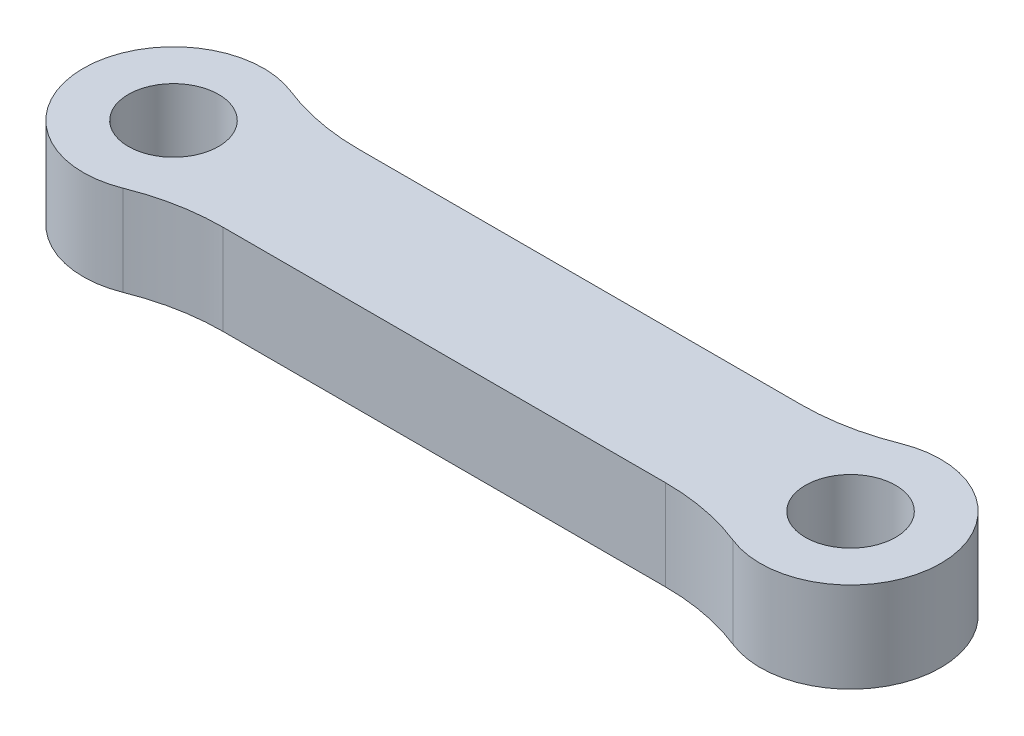
ISO-10303-21;
HEADER;
FILE_DESCRIPTION(('STEP AP214'),'2;1');
FILE_NAME('part.step','',(''),(''),'','','');
FILE_SCHEMA(('AUTOMOTIVE_DESIGN { 1 0 10303 214 1 1 1 1 }'));
ENDSEC;
DATA;
#1=APPLICATION_CONTEXT('core data for automotive mechanical design processes');
#2=APPLICATION_PROTOCOL_DEFINITION('international standard','automotive_design',2000,#1);
#3=PRODUCT_CONTEXT('',#1,'mechanical');
#4=PRODUCT('Part','Part','',(#3));
#5=PRODUCT_RELATED_PRODUCT_CATEGORY('part','',(#4));
#6=PRODUCT_DEFINITION_FORMATION('','',#4);
#7=PRODUCT_DEFINITION_CONTEXT('part definition',#1,'design');
#8=PRODUCT_DEFINITION('design','',#6,#7);
#9=PRODUCT_DEFINITION_SHAPE('','',#8);
#10=(LENGTH_UNIT() NAMED_UNIT(*) SI_UNIT(.MILLI.,.METRE.));
#11=(NAMED_UNIT(*) PLANE_ANGLE_UNIT() SI_UNIT($,.RADIAN.));
#12=(NAMED_UNIT(*) SI_UNIT($,.STERADIAN.) SOLID_ANGLE_UNIT());
#13=UNCERTAINTY_MEASURE_WITH_UNIT(LENGTH_MEASURE(1.E-05),#10,'distance_accuracy_value','');
#14=(GEOMETRIC_REPRESENTATION_CONTEXT(3) GLOBAL_UNCERTAINTY_ASSIGNED_CONTEXT((#13)) GLOBAL_UNIT_ASSIGNED_CONTEXT((#10,
#11,#12)) REPRESENTATION_CONTEXT('',''));
#15=CARTESIAN_POINT('',(0.,0.,0.));
#16=DIRECTION('',(0.,0.,1.));
#17=DIRECTION('',(1.,0.,0.));
#18=AXIS2_PLACEMENT_3D('',#15,#16,#17);
#19=CARTESIAN_POINT('',(0.,4.,0.));
#20=DIRECTION('',(0.,1.,0.));
#21=DIRECTION('',(0.,0.,1.));
#22=AXIS2_PLACEMENT_3D('',#19,#20,#21);
#23=PLANE('',#22);
#24=CARTESIAN_POINT('',(0.,4.,0.));
#25=DIRECTION('',(0.,1.,0.));
#26=DIRECTION('',(0.,0.,1.));
#27=AXIS2_PLACEMENT_3D('',#24,#25,#26);
#28=CIRCLE('',#27,2.);
#29=CARTESIAN_POINT('',(0.,4.,2.));
#30=VERTEX_POINT('',#29);
#31=EDGE_CURVE('E163',#30,#30,#28,.T.);
#32=ORIENTED_EDGE('',*,*,#31,.F.);
#33=EDGE_LOOP('',(#32));
#34=FACE_BOUND('',#33,.T.);
#35=DIRECTION('',(-1.,0.,0.));
#36=VECTOR('',#35,1.);
#37=CARTESIAN_POINT('',(2.64575131106459,4.,-3.));
#38=LINE('',#37,#36);
#39=CARTESIAN_POINT('',(24.8038475772934,4.,-3.));
#40=VERTEX_POINT('',#39);
#41=CARTESIAN_POINT('',(5.19615242270663,4.,-3.));
#42=VERTEX_POINT('',#41);
#43=EDGE_CURVE('E116',#40,#42,#38,.T.);
#44=ORIENTED_EDGE('',*,*,#43,.T.);
#45=CARTESIAN_POINT('',(5.19615242270663,4.,-13.));
#46=DIRECTION('',(0.,1.,0.));
#47=DIRECTION('',(0.,0.,1.));
#48=AXIS2_PLACEMENT_3D('',#45,#46,#47);
#49=CIRCLE('',#48,10.);
#50=CARTESIAN_POINT('',(1.48461497791618,4.,-3.71428571428571));
#51=VERTEX_POINT('',#50);
#52=EDGE_CURVE('E148',#42,#51,#49,.F.);
#53=ORIENTED_EDGE('',*,*,#52,.T.);
#54=CARTESIAN_POINT('',(0.,4.,0.));
#55=DIRECTION('',(0.,1.,0.));
#56=DIRECTION('',(0.,0.,1.));
#57=AXIS2_PLACEMENT_3D('',#54,#55,#56);
#58=CIRCLE('',#57,4.);
#59=CARTESIAN_POINT('',(1.48461497791618,4.,3.71428571428571));
#60=VERTEX_POINT('',#59);
#61=EDGE_CURVE('E124',#51,#60,#58,.T.);
#62=ORIENTED_EDGE('',*,*,#61,.T.);
#63=CARTESIAN_POINT('',(5.19615242270663,4.,13.));
#64=DIRECTION('',(0.,1.,0.));
#65=DIRECTION('',(0.,0.,1.));
#66=AXIS2_PLACEMENT_3D('',#63,#64,#65);
#67=CIRCLE('',#66,10.);
#68=CARTESIAN_POINT('',(5.19615242270663,4.,3.));
#69=VERTEX_POINT('',#68);
#70=EDGE_CURVE('E11',#60,#69,#67,.F.);
#71=ORIENTED_EDGE('',*,*,#70,.T.);
#72=DIRECTION('',(1.,0.,0.));
#73=VECTOR('',#72,1.);
#74=CARTESIAN_POINT('',(2.64575131106459,4.,3.));
#75=LINE('',#74,#73);
#76=CARTESIAN_POINT('',(24.8038475772934,4.,3.));
#77=VERTEX_POINT('',#76);
#78=EDGE_CURVE('E127',#69,#77,#75,.T.);
#79=ORIENTED_EDGE('',*,*,#78,.T.);
#80=CARTESIAN_POINT('',(24.8038475772934,4.,13.));
#81=DIRECTION('',(0.,1.,0.));
#82=DIRECTION('',(0.,0.,1.));
#83=AXIS2_PLACEMENT_3D('',#80,#81,#82);
#84=CIRCLE('',#83,10.);
#85=CARTESIAN_POINT('',(28.5153850220838,4.,3.71428571428572));
#86=VERTEX_POINT('',#85);
#87=EDGE_CURVE('E152',#77,#86,#84,.F.);
#88=ORIENTED_EDGE('',*,*,#87,.T.);
#89=CARTESIAN_POINT('',(30.,4.,0.));
#90=DIRECTION('',(0.,1.,0.));
#91=DIRECTION('',(0.,0.,-1.));
#92=AXIS2_PLACEMENT_3D('',#89,#90,#91);
#93=CIRCLE('',#92,4.);
#94=CARTESIAN_POINT('',(28.5153850220838,4.,-3.71428571428572));
#95=VERTEX_POINT('',#94);
#96=EDGE_CURVE('E167',#86,#95,#93,.T.);
#97=ORIENTED_EDGE('',*,*,#96,.T.);
#98=CARTESIAN_POINT('',(24.8038475772934,4.,-13.));
#99=DIRECTION('',(0.,1.,0.));
#100=DIRECTION('',(0.,0.,1.));
#101=AXIS2_PLACEMENT_3D('',#98,#99,#100);
#102=CIRCLE('',#101,10.);
#103=EDGE_CURVE('E107',#95,#40,#102,.F.);
#104=ORIENTED_EDGE('',*,*,#103,.T.);
#105=EDGE_LOOP('',(#44,#53,#62,#71,#79,#88,#97,#104));
#106=FACE_BOUND('',#105,.T.);
#107=CARTESIAN_POINT('',(30.,4.,0.));
#108=DIRECTION('',(0.,1.,0.));
#109=DIRECTION('',(0.,0.,1.));
#110=AXIS2_PLACEMENT_3D('',#107,#108,#109);
#111=CIRCLE('',#110,2.);
#112=CARTESIAN_POINT('',(30.,4.,2.));
#113=VERTEX_POINT('',#112);
#114=EDGE_CURVE('E284',#113,#113,#111,.T.);
#115=ORIENTED_EDGE('',*,*,#114,.F.);
#116=EDGE_LOOP('',(#115));
#117=FACE_BOUND('',#116,.T.);
#118=ADVANCED_FACE('F32',(#34,#106,#117),#23,.T.);
#119=CARTESIAN_POINT('',(0.,0.,0.));
#120=DIRECTION('',(0.,1.,0.));
#121=DIRECTION('',(0.,0.,1.));
#122=AXIS2_PLACEMENT_3D('',#119,#120,#121);
#123=PLANE('',#122);
#124=CARTESIAN_POINT('',(0.,0.,0.));
#125=DIRECTION('',(0.,1.,0.));
#126=DIRECTION('',(0.,0.,1.));
#127=AXIS2_PLACEMENT_3D('',#124,#125,#126);
#128=CIRCLE('',#127,4.);
#129=CARTESIAN_POINT('',(1.48461497791618,0.,-3.71428571428571));
#130=VERTEX_POINT('',#129);
#131=CARTESIAN_POINT('',(1.48461497791618,0.,3.71428571428571));
#132=VERTEX_POINT('',#131);
#133=EDGE_CURVE('E155',#130,#132,#128,.T.);
#134=ORIENTED_EDGE('',*,*,#133,.F.);
#135=CARTESIAN_POINT('',(5.19615242270663,0.,-13.));
#136=DIRECTION('',(0.,1.,0.));
#137=DIRECTION('',(0.,0.,1.));
#138=AXIS2_PLACEMENT_3D('',#135,#136,#137);
#139=CIRCLE('',#138,10.);
#140=CARTESIAN_POINT('',(5.19615242270663,0.,-3.));
#141=VERTEX_POINT('',#140);
#142=EDGE_CURVE('E123',#130,#141,#139,.T.);
#143=ORIENTED_EDGE('',*,*,#142,.T.);
#144=DIRECTION('',(-1.,0.,0.));
#145=VECTOR('',#144,1.);
#146=CARTESIAN_POINT('',(2.64575131106459,0.,-3.));
#147=LINE('',#146,#145);
#148=CARTESIAN_POINT('',(24.8038475772934,0.,-3.));
#149=VERTEX_POINT('',#148);
#150=EDGE_CURVE('E113',#149,#141,#147,.T.);
#151=ORIENTED_EDGE('',*,*,#150,.F.);
#152=CARTESIAN_POINT('',(24.8038475772934,0.,-13.));
#153=DIRECTION('',(0.,1.,0.));
#154=DIRECTION('',(0.,0.,1.));
#155=AXIS2_PLACEMENT_3D('',#152,#153,#154);
#156=CIRCLE('',#155,10.);
#157=CARTESIAN_POINT('',(28.5153850220838,0.,-3.71428571428572));
#158=VERTEX_POINT('',#157);
#159=EDGE_CURVE('E97',#149,#158,#156,.T.);
#160=ORIENTED_EDGE('',*,*,#159,.T.);
#161=CARTESIAN_POINT('',(30.,0.,0.));
#162=DIRECTION('',(0.,1.,0.));
#163=DIRECTION('',(0.,0.,-1.));
#164=AXIS2_PLACEMENT_3D('',#161,#162,#163);
#165=CIRCLE('',#164,4.);
#166=CARTESIAN_POINT('',(28.5153850220838,0.,3.71428571428572));
#167=VERTEX_POINT('',#166);
#168=EDGE_CURVE('E125',#167,#158,#165,.T.);
#169=ORIENTED_EDGE('',*,*,#168,.F.);
#170=CARTESIAN_POINT('',(24.8038475772934,0.,13.));
#171=DIRECTION('',(0.,1.,0.));
#172=DIRECTION('',(0.,0.,1.));
#173=AXIS2_PLACEMENT_3D('',#170,#171,#172);
#174=CIRCLE('',#173,10.);
#175=CARTESIAN_POINT('',(24.8038475772934,0.,3.));
#176=VERTEX_POINT('',#175);
#177=EDGE_CURVE('E150',#167,#176,#174,.T.);
#178=ORIENTED_EDGE('',*,*,#177,.T.);
#179=DIRECTION('',(1.,0.,0.));
#180=VECTOR('',#179,1.);
#181=CARTESIAN_POINT('',(2.64575131106459,0.,3.));
#182=LINE('',#181,#180);
#183=CARTESIAN_POINT('',(5.19615242270663,0.,3.));
#184=VERTEX_POINT('',#183);
#185=EDGE_CURVE('E129',#184,#176,#182,.T.);
#186=ORIENTED_EDGE('',*,*,#185,.F.);
#187=CARTESIAN_POINT('',(5.19615242270663,0.,13.));
#188=DIRECTION('',(0.,1.,0.));
#189=DIRECTION('',(0.,0.,1.));
#190=AXIS2_PLACEMENT_3D('',#187,#188,#189);
#191=CIRCLE('',#190,10.);
#192=EDGE_CURVE('E40',#184,#132,#191,.T.);
#193=ORIENTED_EDGE('',*,*,#192,.T.);
#194=EDGE_LOOP('',(#134,#143,#151,#160,#169,#178,#186,#193));
#195=FACE_BOUND('',#194,.T.);
#196=CARTESIAN_POINT('',(0.,0.,0.));
#197=DIRECTION('',(0.,1.,0.));
#198=DIRECTION('',(0.,0.,1.));
#199=AXIS2_PLACEMENT_3D('',#196,#197,#198);
#200=CIRCLE('',#199,2.);
#201=CARTESIAN_POINT('',(0.,0.,2.));
#202=VERTEX_POINT('',#201);
#203=EDGE_CURVE('E290',#202,#202,#200,.T.);
#204=ORIENTED_EDGE('',*,*,#203,.T.);
#205=EDGE_LOOP('',(#204));
#206=FACE_BOUND('',#205,.T.);
#207=CARTESIAN_POINT('',(30.,0.,0.));
#208=DIRECTION('',(0.,1.,0.));
#209=DIRECTION('',(0.,0.,1.));
#210=AXIS2_PLACEMENT_3D('',#207,#208,#209);
#211=CIRCLE('',#210,2.);
#212=CARTESIAN_POINT('',(30.,0.,2.));
#213=VERTEX_POINT('',#212);
#214=EDGE_CURVE('E287',#213,#213,#211,.T.);
#215=ORIENTED_EDGE('',*,*,#214,.T.);
#216=EDGE_LOOP('',(#215));
#217=FACE_BOUND('',#216,.T.);
#218=ADVANCED_FACE('F121',(#195,#206,#217),#123,.F.);
#219=CARTESIAN_POINT('',(0.,4.,0.));
#220=DIRECTION('',(0.,-1.,0.));
#221=DIRECTION('',(0.,0.,-1.));
#222=AXIS2_PLACEMENT_3D('',#219,#220,#221);
#223=CYLINDRICAL_SURFACE('',#222,4.);
#224=ORIENTED_EDGE('',*,*,#61,.F.);
#225=DIRECTION('',(0.,-1.,0.));
#226=VECTOR('',#225,1.);
#227=CARTESIAN_POINT('',(1.48461497791618,4.,-3.71428571428571));
#228=LINE('',#227,#226);
#229=EDGE_CURVE('E139',#51,#130,#228,.T.);
#230=ORIENTED_EDGE('',*,*,#229,.T.);
#231=ORIENTED_EDGE('',*,*,#133,.T.);
#232=DIRECTION('',(0.,-1.,0.));
#233=VECTOR('',#232,1.);
#234=CARTESIAN_POINT('',(1.48461497791618,4.,3.71428571428571));
#235=LINE('',#234,#233);
#236=EDGE_CURVE('E137',#132,#60,#235,.F.);
#237=ORIENTED_EDGE('',*,*,#236,.T.);
#238=EDGE_LOOP('',(#224,#230,#231,#237));
#239=FACE_BOUND('',#238,.T.);
#240=ADVANCED_FACE('F161',(#239),#223,.T.);
#241=CARTESIAN_POINT('',(2.64575131106459,4.,3.));
#242=DIRECTION('',(0.,0.,-1.));
#243=DIRECTION('',(-1.,0.,0.));
#244=AXIS2_PLACEMENT_3D('',#241,#242,#243);
#245=PLANE('',#244);
#246=ORIENTED_EDGE('',*,*,#185,.T.);
#247=DIRECTION('',(0.,1.,0.));
#248=VECTOR('',#247,1.);
#249=CARTESIAN_POINT('',(24.8038475772934,4.,3.));
#250=LINE('',#249,#248);
#251=EDGE_CURVE('E47',#176,#77,#250,.T.);
#252=ORIENTED_EDGE('',*,*,#251,.T.);
#253=ORIENTED_EDGE('',*,*,#78,.F.);
#254=DIRECTION('',(0.,1.,0.));
#255=VECTOR('',#254,1.);
#256=CARTESIAN_POINT('',(5.19615242270663,0.,3.));
#257=LINE('',#256,#255);
#258=EDGE_CURVE('E142',#69,#184,#257,.F.);
#259=ORIENTED_EDGE('',*,*,#258,.T.);
#260=EDGE_LOOP('',(#246,#252,#253,#259));
#261=FACE_BOUND('',#260,.T.);
#262=ADVANCED_FACE('F165',(#261),#245,.F.);
#263=CARTESIAN_POINT('',(30.,4.,0.));
#264=DIRECTION('',(0.,-1.,0.));
#265=DIRECTION('',(0.,0.,-1.));
#266=AXIS2_PLACEMENT_3D('',#263,#264,#265);
#267=CYLINDRICAL_SURFACE('',#266,4.);
#268=ORIENTED_EDGE('',*,*,#168,.T.);
#269=DIRECTION('',(0.,-1.,0.));
#270=VECTOR('',#269,1.);
#271=CARTESIAN_POINT('',(28.5153850220838,4.,-3.71428571428572));
#272=LINE('',#271,#270);
#273=EDGE_CURVE('E102',#158,#95,#272,.F.);
#274=ORIENTED_EDGE('',*,*,#273,.T.);
#275=ORIENTED_EDGE('',*,*,#96,.F.);
#276=DIRECTION('',(0.,-1.,0.));
#277=VECTOR('',#276,1.);
#278=CARTESIAN_POINT('',(28.5153850220838,4.,3.71428571428572));
#279=LINE('',#278,#277);
#280=EDGE_CURVE('E117',#86,#167,#279,.T.);
#281=ORIENTED_EDGE('',*,*,#280,.T.);
#282=EDGE_LOOP('',(#268,#274,#275,#281));
#283=FACE_BOUND('',#282,.T.);
#284=ADVANCED_FACE('F201',(#283),#267,.T.);
#285=CARTESIAN_POINT('',(2.64575131106459,4.,-3.));
#286=DIRECTION('',(0.,0.,1.));
#287=DIRECTION('',(1.,0.,0.));
#288=AXIS2_PLACEMENT_3D('',#285,#286,#287);
#289=PLANE('',#288);
#290=ORIENTED_EDGE('',*,*,#43,.F.);
#291=DIRECTION('',(0.,1.,0.));
#292=VECTOR('',#291,1.);
#293=CARTESIAN_POINT('',(24.8038475772934,0.,-3.));
#294=LINE('',#293,#292);
#295=EDGE_CURVE('E101',#40,#149,#294,.F.);
#296=ORIENTED_EDGE('',*,*,#295,.T.);
#297=ORIENTED_EDGE('',*,*,#150,.T.);
#298=DIRECTION('',(0.,1.,0.));
#299=VECTOR('',#298,1.);
#300=CARTESIAN_POINT('',(5.19615242270663,4.,-3.));
#301=LINE('',#300,#299);
#302=EDGE_CURVE('E118',#141,#42,#301,.T.);
#303=ORIENTED_EDGE('',*,*,#302,.T.);
#304=EDGE_LOOP('',(#290,#296,#297,#303));
#305=FACE_BOUND('',#304,.T.);
#306=ADVANCED_FACE('F112',(#305),#289,.F.);
#307=CARTESIAN_POINT('',(0.,4.,0.));
#308=DIRECTION('',(0.,-1.,0.));
#309=DIRECTION('',(0.,0.,-1.));
#310=AXIS2_PLACEMENT_3D('',#307,#308,#309);
#311=CYLINDRICAL_SURFACE('',#310,2.);
#312=ORIENTED_EDGE('',*,*,#31,.T.);
#313=EDGE_LOOP('',(#312));
#314=FACE_BOUND('',#313,.T.);
#315=ORIENTED_EDGE('',*,*,#203,.F.);
#316=EDGE_LOOP('',(#315));
#317=FACE_BOUND('',#316,.T.);
#318=ADVANCED_FACE('F196',(#314,#317),#311,.F.);
#319=CARTESIAN_POINT('',(30.,4.,0.));
#320=DIRECTION('',(0.,-1.,0.));
#321=DIRECTION('',(0.,0.,-1.));
#322=AXIS2_PLACEMENT_3D('',#319,#320,#321);
#323=CYLINDRICAL_SURFACE('',#322,2.);
#324=ORIENTED_EDGE('',*,*,#114,.T.);
#325=EDGE_LOOP('',(#324));
#326=FACE_BOUND('',#325,.T.);
#327=ORIENTED_EDGE('',*,*,#214,.F.);
#328=EDGE_LOOP('',(#327));
#329=FACE_BOUND('',#328,.T.);
#330=ADVANCED_FACE('F185',(#326,#329),#323,.F.);
#331=CARTESIAN_POINT('',(24.8038475772934,4.,-13.));
#332=DIRECTION('',(0.,-1.,0.));
#333=DIRECTION('',(0.,0.,-1.));
#334=AXIS2_PLACEMENT_3D('',#331,#332,#333);
#335=CYLINDRICAL_SURFACE('',#334,10.);
#336=ORIENTED_EDGE('',*,*,#103,.F.);
#337=ORIENTED_EDGE('',*,*,#273,.F.);
#338=ORIENTED_EDGE('',*,*,#159,.F.);
#339=ORIENTED_EDGE('',*,*,#295,.F.);
#340=EDGE_LOOP('',(#336,#337,#338,#339));
#341=FACE_BOUND('',#340,.T.);
#342=ADVANCED_FACE('F100',(#341),#335,.F.);
#343=CARTESIAN_POINT('',(5.19615242270663,4.,-13.));
#344=DIRECTION('',(0.,-1.,0.));
#345=DIRECTION('',(0.,0.,-1.));
#346=AXIS2_PLACEMENT_3D('',#343,#344,#345);
#347=CYLINDRICAL_SURFACE('',#346,10.);
#348=ORIENTED_EDGE('',*,*,#52,.F.);
#349=ORIENTED_EDGE('',*,*,#302,.F.);
#350=ORIENTED_EDGE('',*,*,#142,.F.);
#351=ORIENTED_EDGE('',*,*,#229,.F.);
#352=EDGE_LOOP('',(#348,#349,#350,#351));
#353=FACE_BOUND('',#352,.T.);
#354=ADVANCED_FACE('F176',(#353),#347,.F.);
#355=CARTESIAN_POINT('',(24.8038475772934,4.,13.));
#356=DIRECTION('',(0.,-1.,0.));
#357=DIRECTION('',(0.,0.,-1.));
#358=AXIS2_PLACEMENT_3D('',#355,#356,#357);
#359=CYLINDRICAL_SURFACE('',#358,10.);
#360=ORIENTED_EDGE('',*,*,#87,.F.);
#361=ORIENTED_EDGE('',*,*,#251,.F.);
#362=ORIENTED_EDGE('',*,*,#177,.F.);
#363=ORIENTED_EDGE('',*,*,#280,.F.);
#364=EDGE_LOOP('',(#360,#361,#362,#363));
#365=FACE_BOUND('',#364,.T.);
#366=ADVANCED_FACE('F178',(#365),#359,.F.);
#367=CARTESIAN_POINT('',(5.19615242270663,4.,13.));
#368=DIRECTION('',(0.,-1.,0.));
#369=DIRECTION('',(0.,0.,-1.));
#370=AXIS2_PLACEMENT_3D('',#367,#368,#369);
#371=CYLINDRICAL_SURFACE('',#370,10.);
#372=ORIENTED_EDGE('',*,*,#70,.F.);
#373=ORIENTED_EDGE('',*,*,#236,.F.);
#374=ORIENTED_EDGE('',*,*,#192,.F.);
#375=ORIENTED_EDGE('',*,*,#258,.F.);
#376=EDGE_LOOP('',(#372,#373,#374,#375));
#377=FACE_BOUND('',#376,.T.);
#378=ADVANCED_FACE('F34',(#377),#371,.F.);
#379=CLOSED_SHELL('',(#118,#218,#240,#262,#284,#306,#318,#330,#342,#354,#366,#378));
#380=MANIFOLD_SOLID_BREP('B2',#379);
#381=ADVANCED_BREP_SHAPE_REPRESENTATION('',(#18,#380),#14);
#382=SHAPE_DEFINITION_REPRESENTATION(#9,#381);
ENDSEC;
END-ISO-10303-21;
